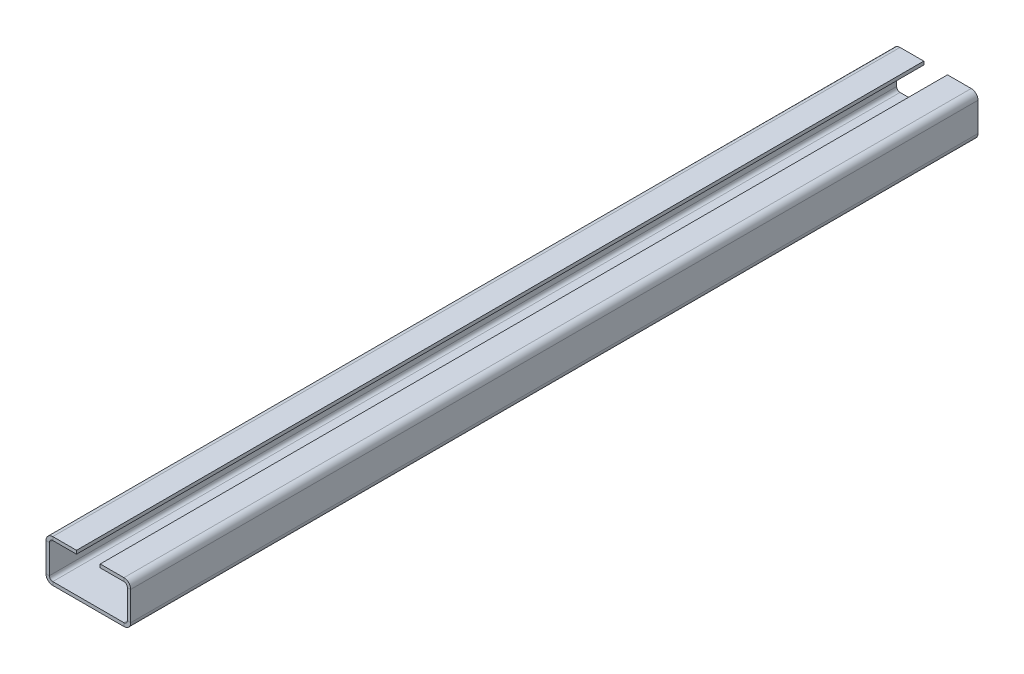
ISO-10303-21;
HEADER;
FILE_DESCRIPTION(('STEP AP214'),'2;1');
FILE_NAME('part.step','',(''),(''),'','','');
FILE_SCHEMA(('AUTOMOTIVE_DESIGN { 1 0 10303 214 1 1 1 1 }'));
ENDSEC;
DATA;
#1=APPLICATION_CONTEXT('core data for automotive mechanical design processes');
#2=APPLICATION_PROTOCOL_DEFINITION('international standard','automotive_design',2000,#1);
#3=PRODUCT_CONTEXT('',#1,'mechanical');
#4=PRODUCT('Part','Part','',(#3));
#5=PRODUCT_RELATED_PRODUCT_CATEGORY('part','',(#4));
#6=PRODUCT_DEFINITION_FORMATION('','',#4);
#7=PRODUCT_DEFINITION_CONTEXT('part definition',#1,'design');
#8=PRODUCT_DEFINITION('design','',#6,#7);
#9=PRODUCT_DEFINITION_SHAPE('','',#8);
#10=(LENGTH_UNIT() NAMED_UNIT(*) SI_UNIT(.MILLI.,.METRE.));
#11=(NAMED_UNIT(*) PLANE_ANGLE_UNIT() SI_UNIT($,.RADIAN.));
#12=(NAMED_UNIT(*) SI_UNIT($,.STERADIAN.) SOLID_ANGLE_UNIT());
#13=UNCERTAINTY_MEASURE_WITH_UNIT(LENGTH_MEASURE(1.E-05),#10,'distance_accuracy_value','');
#14=(GEOMETRIC_REPRESENTATION_CONTEXT(3) GLOBAL_UNCERTAINTY_ASSIGNED_CONTEXT((#13)) GLOBAL_UNIT_ASSIGNED_CONTEXT((#10,
#11,#12)) REPRESENTATION_CONTEXT('',''));
#15=CARTESIAN_POINT('',(0.,0.,0.));
#16=DIRECTION('',(0.,0.,1.));
#17=DIRECTION('',(1.,0.,0.));
#18=AXIS2_PLACEMENT_3D('',#15,#16,#17);
#19=CARTESIAN_POINT('',(4.,25.,500.));
#20=DIRECTION('',(0.,0.,1.));
#21=DIRECTION('',(1.,0.,0.));
#22=AXIS2_PLACEMENT_3D('',#19,#20,#21);
#23=PLANE('',#22);
#24=DIRECTION('',(0.,-1.,0.));
#25=VECTOR('',#24,1.);
#26=CARTESIAN_POINT('',(4.,25.,500.));
#27=LINE('',#26,#25);
#28=CARTESIAN_POINT('',(4.,25.,500.));
#29=VERTEX_POINT('',#28);
#30=CARTESIAN_POINT('',(4.,23.,500.));
#31=VERTEX_POINT('',#30);
#32=EDGE_CURVE('E11',#29,#31,#27,.T.);
#33=ORIENTED_EDGE('',*,*,#32,.F.);
#34=CARTESIAN_POINT('',(4.,21.,500.));
#35=DIRECTION('',(0.,0.,-1.));
#36=DIRECTION('',(-1.,0.,0.));
#37=AXIS2_PLACEMENT_3D('',#34,#35,#36);
#38=CIRCLE('',#37,4.);
#39=CARTESIAN_POINT('',(0.,21.,500.));
#40=VERTEX_POINT('',#39);
#41=EDGE_CURVE('E361',#29,#40,#38,.F.);
#42=ORIENTED_EDGE('',*,*,#41,.T.);
#43=DIRECTION('',(-1.,0.,0.));
#44=VECTOR('',#43,1.);
#45=CARTESIAN_POINT('',(2.,21.,500.));
#46=LINE('',#45,#44);
#47=CARTESIAN_POINT('',(2.,21.,500.));
#48=VERTEX_POINT('',#47);
#49=EDGE_CURVE('E44',#48,#40,#46,.T.);
#50=ORIENTED_EDGE('',*,*,#49,.F.);
#51=CARTESIAN_POINT('',(4.,21.,500.));
#52=DIRECTION('',(0.,0.,1.));
#53=DIRECTION('',(1.,0.,0.));
#54=AXIS2_PLACEMENT_3D('',#51,#52,#53);
#55=CIRCLE('',#54,2.);
#56=EDGE_CURVE('E436',#31,#48,#55,.T.);
#57=ORIENTED_EDGE('',*,*,#56,.F.);
#58=EDGE_LOOP('',(#33,#42,#50,#57));
#59=FACE_BOUND('',#58,.T.);
#60=ADVANCED_FACE('F36',(#59),#23,.T.);
#61=CARTESIAN_POINT('',(2.,21.,500.));
#62=DIRECTION('',(0.,0.,1.));
#63=DIRECTION('',(1.,0.,0.));
#64=AXIS2_PLACEMENT_3D('',#61,#62,#63);
#65=PLANE('',#64);
#66=DIRECTION('',(-1.,0.,0.));
#67=VECTOR('',#66,1.);
#68=CARTESIAN_POINT('',(18.,25.,500.));
#69=LINE('',#68,#67);
#70=CARTESIAN_POINT('',(18.,25.,500.));
#71=VERTEX_POINT('',#70);
#72=EDGE_CURVE('E365',#71,#29,#69,.T.);
#73=ORIENTED_EDGE('',*,*,#72,.T.);
#74=ORIENTED_EDGE('',*,*,#32,.T.);
#75=DIRECTION('',(1.,0.,0.));
#76=VECTOR('',#75,1.);
#77=CARTESIAN_POINT('',(18.,23.,500.));
#78=LINE('',#77,#76);
#79=CARTESIAN_POINT('',(18.,23.,500.));
#80=VERTEX_POINT('',#79);
#81=EDGE_CURVE('E438',#80,#31,#78,.F.);
#82=ORIENTED_EDGE('',*,*,#81,.F.);
#83=DIRECTION('',(0.,-1.,0.));
#84=VECTOR('',#83,1.);
#85=CARTESIAN_POINT('',(18.,25.,500.));
#86=LINE('',#85,#84);
#87=EDGE_CURVE('E441',#71,#80,#86,.T.);
#88=ORIENTED_EDGE('',*,*,#87,.F.);
#89=EDGE_LOOP('',(#73,#74,#82,#88));
#90=FACE_BOUND('',#89,.T.);
#91=ADVANCED_FACE('F447',(#90),#65,.T.);
#92=CARTESIAN_POINT('',(0.,21.,0.));
#93=DIRECTION('',(0.,0.,-1.));
#94=DIRECTION('',(-1.,0.,0.));
#95=AXIS2_PLACEMENT_3D('',#92,#93,#94);
#96=PLANE('',#95);
#97=DIRECTION('',(1.,0.,0.));
#98=VECTOR('',#97,1.);
#99=CARTESIAN_POINT('',(0.,21.,0.));
#100=LINE('',#99,#98);
#101=CARTESIAN_POINT('',(0.,21.,0.));
#102=VERTEX_POINT('',#101);
#103=CARTESIAN_POINT('',(2.,21.,0.));
#104=VERTEX_POINT('',#103);
#105=EDGE_CURVE('E345',#102,#104,#100,.T.);
#106=ORIENTED_EDGE('',*,*,#105,.F.);
#107=CARTESIAN_POINT('',(4.,21.,0.));
#108=DIRECTION('',(0.,0.,-1.));
#109=DIRECTION('',(-1.,0.,0.));
#110=AXIS2_PLACEMENT_3D('',#107,#108,#109);
#111=CIRCLE('',#110,4.);
#112=CARTESIAN_POINT('',(4.,25.,0.));
#113=VERTEX_POINT('',#112);
#114=EDGE_CURVE('E261',#113,#102,#111,.F.);
#115=ORIENTED_EDGE('',*,*,#114,.F.);
#116=DIRECTION('',(0.,1.,0.));
#117=VECTOR('',#116,1.);
#118=CARTESIAN_POINT('',(4.,23.,0.));
#119=LINE('',#118,#117);
#120=CARTESIAN_POINT('',(4.,23.,0.));
#121=VERTEX_POINT('',#120);
#122=EDGE_CURVE('E343',#121,#113,#119,.T.);
#123=ORIENTED_EDGE('',*,*,#122,.F.);
#124=CARTESIAN_POINT('',(4.,21.,0.));
#125=DIRECTION('',(0.,0.,1.));
#126=DIRECTION('',(1.,0.,0.));
#127=AXIS2_PLACEMENT_3D('',#124,#125,#126);
#128=CIRCLE('',#127,2.);
#129=EDGE_CURVE('E249',#121,#104,#128,.T.);
#130=ORIENTED_EDGE('',*,*,#129,.T.);
#131=EDGE_LOOP('',(#106,#115,#123,#130));
#132=FACE_BOUND('',#131,.T.);
#133=ADVANCED_FACE('F454',(#132),#96,.T.);
#134=CARTESIAN_POINT('',(4.,23.,0.));
#135=DIRECTION('',(0.,0.,-1.));
#136=DIRECTION('',(-1.,0.,0.));
#137=AXIS2_PLACEMENT_3D('',#134,#135,#136);
#138=PLANE('',#137);
#139=DIRECTION('',(0.,-1.,0.));
#140=VECTOR('',#139,1.);
#141=CARTESIAN_POINT('',(0.,25.,0.));
#142=LINE('',#141,#140);
#143=CARTESIAN_POINT('',(0.,4.,0.));
#144=VERTEX_POINT('',#143);
#145=EDGE_CURVE('E264',#102,#144,#142,.T.);
#146=ORIENTED_EDGE('',*,*,#145,.F.);
#147=ORIENTED_EDGE('',*,*,#105,.T.);
#148=DIRECTION('',(0.,-1.,0.));
#149=VECTOR('',#148,1.);
#150=CARTESIAN_POINT('',(2.,25.,0.));
#151=LINE('',#150,#149);
#152=CARTESIAN_POINT('',(2.,4.,0.));
#153=VERTEX_POINT('',#152);
#154=EDGE_CURVE('E246',#104,#153,#151,.T.);
#155=ORIENTED_EDGE('',*,*,#154,.T.);
#156=DIRECTION('',(-1.,0.,0.));
#157=VECTOR('',#156,1.);
#158=CARTESIAN_POINT('',(2.,4.,0.));
#159=LINE('',#158,#157);
#160=EDGE_CURVE('E335',#153,#144,#159,.T.);
#161=ORIENTED_EDGE('',*,*,#160,.T.);
#162=EDGE_LOOP('',(#146,#147,#155,#161));
#163=FACE_BOUND('',#162,.T.);
#164=ADVANCED_FACE('F457',(#163),#138,.T.);
#165=CARTESIAN_POINT('',(0.,4.,500.));
#166=DIRECTION('',(0.,0.,1.));
#167=DIRECTION('',(1.,0.,0.));
#168=AXIS2_PLACEMENT_3D('',#165,#166,#167);
#169=PLANE('',#168);
#170=DIRECTION('',(1.,0.,0.));
#171=VECTOR('',#170,1.);
#172=CARTESIAN_POINT('',(0.,4.,500.));
#173=LINE('',#172,#171);
#174=CARTESIAN_POINT('',(0.,4.,500.));
#175=VERTEX_POINT('',#174);
#176=CARTESIAN_POINT('',(2.,4.,500.));
#177=VERTEX_POINT('',#176);
#178=EDGE_CURVE('E341',#175,#177,#173,.T.);
#179=ORIENTED_EDGE('',*,*,#178,.F.);
#180=CARTESIAN_POINT('',(4.,4.,500.));
#181=DIRECTION('',(0.,0.,-1.));
#182=DIRECTION('',(-1.,0.,0.));
#183=AXIS2_PLACEMENT_3D('',#180,#181,#182);
#184=CIRCLE('',#183,4.);
#185=CARTESIAN_POINT('',(4.,0.,500.));
#186=VERTEX_POINT('',#185);
#187=EDGE_CURVE('E373',#175,#186,#184,.F.);
#188=ORIENTED_EDGE('',*,*,#187,.T.);
#189=DIRECTION('',(0.,-1.,0.));
#190=VECTOR('',#189,1.);
#191=CARTESIAN_POINT('',(4.,2.,500.));
#192=LINE('',#191,#190);
#193=CARTESIAN_POINT('',(4.,2.,500.));
#194=VERTEX_POINT('',#193);
#195=EDGE_CURVE('E339',#194,#186,#192,.T.);
#196=ORIENTED_EDGE('',*,*,#195,.F.);
#197=CARTESIAN_POINT('',(4.,4.,500.));
#198=DIRECTION('',(0.,0.,1.));
#199=DIRECTION('',(1.,0.,0.));
#200=AXIS2_PLACEMENT_3D('',#197,#198,#199);
#201=CIRCLE('',#200,2.);
#202=EDGE_CURVE('E432',#177,#194,#201,.T.);
#203=ORIENTED_EDGE('',*,*,#202,.F.);
#204=EDGE_LOOP('',(#179,#188,#196,#203));
#205=FACE_BOUND('',#204,.T.);
#206=ADVANCED_FACE('F477',(#205),#169,.T.);
#207=CARTESIAN_POINT('',(4.,2.,500.));
#208=DIRECTION('',(0.,0.,1.));
#209=DIRECTION('',(1.,0.,0.));
#210=AXIS2_PLACEMENT_3D('',#207,#208,#209);
#211=PLANE('',#210);
#212=DIRECTION('',(0.,-1.,0.));
#213=VECTOR('',#212,1.);
#214=CARTESIAN_POINT('',(0.,25.,500.));
#215=LINE('',#214,#213);
#216=EDGE_CURVE('E352',#40,#175,#215,.T.);
#217=ORIENTED_EDGE('',*,*,#216,.T.);
#218=ORIENTED_EDGE('',*,*,#178,.T.);
#219=DIRECTION('',(0.,-1.,0.));
#220=VECTOR('',#219,1.);
#221=CARTESIAN_POINT('',(2.,25.,500.));
#222=LINE('',#221,#220);
#223=EDGE_CURVE('E355',#48,#177,#222,.T.);
#224=ORIENTED_EDGE('',*,*,#223,.F.);
#225=ORIENTED_EDGE('',*,*,#49,.T.);
#226=EDGE_LOOP('',(#217,#218,#224,#225));
#227=FACE_BOUND('',#226,.T.);
#228=ADVANCED_FACE('F350',(#227),#211,.T.);
#229=CARTESIAN_POINT('',(4.,0.,0.));
#230=DIRECTION('',(0.,0.,-1.));
#231=DIRECTION('',(-1.,0.,0.));
#232=AXIS2_PLACEMENT_3D('',#229,#230,#231);
#233=PLANE('',#232);
#234=DIRECTION('',(0.,1.,0.));
#235=VECTOR('',#234,1.);
#236=CARTESIAN_POINT('',(4.,0.,0.));
#237=LINE('',#236,#235);
#238=CARTESIAN_POINT('',(4.,0.,0.));
#239=VERTEX_POINT('',#238);
#240=CARTESIAN_POINT('',(4.,2.,0.));
#241=VERTEX_POINT('',#240);
#242=EDGE_CURVE('E337',#239,#241,#237,.T.);
#243=ORIENTED_EDGE('',*,*,#242,.F.);
#244=CARTESIAN_POINT('',(4.,4.,0.));
#245=DIRECTION('',(0.,0.,-1.));
#246=DIRECTION('',(-1.,0.,0.));
#247=AXIS2_PLACEMENT_3D('',#244,#245,#246);
#248=CIRCLE('',#247,4.);
#249=EDGE_CURVE('E267',#144,#239,#248,.F.);
#250=ORIENTED_EDGE('',*,*,#249,.F.);
#251=ORIENTED_EDGE('',*,*,#160,.F.);
#252=CARTESIAN_POINT('',(4.,4.,0.));
#253=DIRECTION('',(0.,0.,1.));
#254=DIRECTION('',(1.,0.,0.));
#255=AXIS2_PLACEMENT_3D('',#252,#253,#254);
#256=CIRCLE('',#255,2.);
#257=EDGE_CURVE('E243',#153,#241,#256,.T.);
#258=ORIENTED_EDGE('',*,*,#257,.T.);
#259=EDGE_LOOP('',(#243,#250,#251,#258));
#260=FACE_BOUND('',#259,.T.);
#261=ADVANCED_FACE('F471',(#260),#233,.T.);
#262=CARTESIAN_POINT('',(2.,4.,0.));
#263=DIRECTION('',(0.,0.,-1.));
#264=DIRECTION('',(-1.,0.,0.));
#265=AXIS2_PLACEMENT_3D('',#262,#263,#264);
#266=PLANE('',#265);
#267=DIRECTION('',(1.,0.,0.));
#268=VECTOR('',#267,1.);
#269=CARTESIAN_POINT('',(0.,0.,0.));
#270=LINE('',#269,#268);
#271=CARTESIAN_POINT('',(46.,0.,0.));
#272=VERTEX_POINT('',#271);
#273=EDGE_CURVE('E270',#239,#272,#270,.T.);
#274=ORIENTED_EDGE('',*,*,#273,.F.);
#275=ORIENTED_EDGE('',*,*,#242,.T.);
#276=DIRECTION('',(1.,0.,0.));
#277=VECTOR('',#276,1.);
#278=CARTESIAN_POINT('',(0.,2.,0.));
#279=LINE('',#278,#277);
#280=CARTESIAN_POINT('',(46.,2.,0.));
#281=VERTEX_POINT('',#280);
#282=EDGE_CURVE('E240',#241,#281,#279,.T.);
#283=ORIENTED_EDGE('',*,*,#282,.T.);
#284=DIRECTION('',(0.,-1.,0.));
#285=VECTOR('',#284,1.);
#286=CARTESIAN_POINT('',(46.,2.,0.));
#287=LINE('',#286,#285);
#288=EDGE_CURVE('E331',#281,#272,#287,.T.);
#289=ORIENTED_EDGE('',*,*,#288,.T.);
#290=EDGE_LOOP('',(#274,#275,#283,#289));
#291=FACE_BOUND('',#290,.T.);
#292=ADVANCED_FACE('F481',(#291),#266,.T.);
#293=CARTESIAN_POINT('',(46.,0.,500.));
#294=DIRECTION('',(0.,0.,1.));
#295=DIRECTION('',(1.,0.,0.));
#296=AXIS2_PLACEMENT_3D('',#293,#294,#295);
#297=PLANE('',#296);
#298=DIRECTION('',(0.,1.,0.));
#299=VECTOR('',#298,1.);
#300=CARTESIAN_POINT('',(46.,0.,500.));
#301=LINE('',#300,#299);
#302=CARTESIAN_POINT('',(46.,0.,500.));
#303=VERTEX_POINT('',#302);
#304=CARTESIAN_POINT('',(46.,2.,500.));
#305=VERTEX_POINT('',#304);
#306=EDGE_CURVE('E193',#303,#305,#301,.T.);
#307=ORIENTED_EDGE('',*,*,#306,.F.);
#308=CARTESIAN_POINT('',(46.,4.,500.));
#309=DIRECTION('',(0.,0.,-1.));
#310=DIRECTION('',(-1.,0.,0.));
#311=AXIS2_PLACEMENT_3D('',#308,#309,#310);
#312=CIRCLE('',#311,4.);
#313=CARTESIAN_POINT('',(50.,4.,500.));
#314=VERTEX_POINT('',#313);
#315=EDGE_CURVE('E197',#303,#314,#312,.F.);
#316=ORIENTED_EDGE('',*,*,#315,.T.);
#317=DIRECTION('',(1.,0.,0.));
#318=VECTOR('',#317,1.);
#319=CARTESIAN_POINT('',(48.,4.,500.));
#320=LINE('',#319,#318);
#321=CARTESIAN_POINT('',(48.,4.,500.));
#322=VERTEX_POINT('',#321);
#323=EDGE_CURVE('E181',#322,#314,#320,.T.);
#324=ORIENTED_EDGE('',*,*,#323,.F.);
#325=CARTESIAN_POINT('',(46.,4.,500.));
#326=DIRECTION('',(0.,0.,1.));
#327=DIRECTION('',(1.,0.,0.));
#328=AXIS2_PLACEMENT_3D('',#325,#326,#327);
#329=CIRCLE('',#328,2.);
#330=EDGE_CURVE('E394',#305,#322,#329,.T.);
#331=ORIENTED_EDGE('',*,*,#330,.F.);
#332=EDGE_LOOP('',(#307,#316,#324,#331));
#333=FACE_BOUND('',#332,.T.);
#334=ADVANCED_FACE('F199',(#333),#297,.T.);
#335=CARTESIAN_POINT('',(48.,4.,500.));
#336=DIRECTION('',(0.,0.,1.));
#337=DIRECTION('',(1.,0.,0.));
#338=AXIS2_PLACEMENT_3D('',#335,#336,#337);
#339=PLANE('',#338);
#340=DIRECTION('',(1.,0.,0.));
#341=VECTOR('',#340,1.);
#342=CARTESIAN_POINT('',(0.,0.,500.));
#343=LINE('',#342,#341);
#344=EDGE_CURVE('E203',#186,#303,#343,.T.);
#345=ORIENTED_EDGE('',*,*,#344,.T.);
#346=ORIENTED_EDGE('',*,*,#306,.T.);
#347=DIRECTION('',(1.,0.,0.));
#348=VECTOR('',#347,1.);
#349=CARTESIAN_POINT('',(0.,2.,500.));
#350=LINE('',#349,#348);
#351=EDGE_CURVE('E429',#194,#305,#350,.T.);
#352=ORIENTED_EDGE('',*,*,#351,.F.);
#353=ORIENTED_EDGE('',*,*,#195,.T.);
#354=EDGE_LOOP('',(#345,#346,#352,#353));
#355=FACE_BOUND('',#354,.T.);
#356=ADVANCED_FACE('F381',(#355),#339,.T.);
#357=CARTESIAN_POINT('',(50.,4.,0.));
#358=DIRECTION('',(0.,0.,-1.));
#359=DIRECTION('',(-1.,0.,0.));
#360=AXIS2_PLACEMENT_3D('',#357,#358,#359);
#361=PLANE('',#360);
#362=DIRECTION('',(-1.,0.,0.));
#363=VECTOR('',#362,1.);
#364=CARTESIAN_POINT('',(50.,4.,0.));
#365=LINE('',#364,#363);
#366=CARTESIAN_POINT('',(50.,4.,0.));
#367=VERTEX_POINT('',#366);
#368=CARTESIAN_POINT('',(48.,4.,0.));
#369=VERTEX_POINT('',#368);
#370=EDGE_CURVE('E194',#367,#369,#365,.T.);
#371=ORIENTED_EDGE('',*,*,#370,.F.);
#372=CARTESIAN_POINT('',(46.,4.,0.));
#373=DIRECTION('',(0.,0.,-1.));
#374=DIRECTION('',(-1.,0.,0.));
#375=AXIS2_PLACEMENT_3D('',#372,#373,#374);
#376=CIRCLE('',#375,4.);
#377=EDGE_CURVE('E210',#272,#367,#376,.F.);
#378=ORIENTED_EDGE('',*,*,#377,.F.);
#379=ORIENTED_EDGE('',*,*,#288,.F.);
#380=CARTESIAN_POINT('',(46.,4.,0.));
#381=DIRECTION('',(0.,0.,1.));
#382=DIRECTION('',(1.,0.,0.));
#383=AXIS2_PLACEMENT_3D('',#380,#381,#382);
#384=CIRCLE('',#383,2.);
#385=EDGE_CURVE('E237',#281,#369,#384,.T.);
#386=ORIENTED_EDGE('',*,*,#385,.T.);
#387=EDGE_LOOP('',(#371,#378,#379,#386));
#388=FACE_BOUND('',#387,.T.);
#389=ADVANCED_FACE('F388',(#388),#361,.T.);
#390=CARTESIAN_POINT('',(46.,2.,0.));
#391=DIRECTION('',(0.,0.,-1.));
#392=DIRECTION('',(-1.,0.,0.));
#393=AXIS2_PLACEMENT_3D('',#390,#391,#392);
#394=PLANE('',#393);
#395=DIRECTION('',(0.,1.,0.));
#396=VECTOR('',#395,1.);
#397=CARTESIAN_POINT('',(50.,0.,0.));
#398=LINE('',#397,#396);
#399=CARTESIAN_POINT('',(50.,21.,0.));
#400=VERTEX_POINT('',#399);
#401=EDGE_CURVE('E274',#367,#400,#398,.T.);
#402=ORIENTED_EDGE('',*,*,#401,.F.);
#403=ORIENTED_EDGE('',*,*,#370,.T.);
#404=DIRECTION('',(0.,1.,0.));
#405=VECTOR('',#404,1.);
#406=CARTESIAN_POINT('',(48.,0.,0.));
#407=LINE('',#406,#405);
#408=CARTESIAN_POINT('',(48.,21.,0.));
#409=VERTEX_POINT('',#408);
#410=EDGE_CURVE('E235',#369,#409,#407,.T.);
#411=ORIENTED_EDGE('',*,*,#410,.T.);
#412=DIRECTION('',(1.,0.,0.));
#413=VECTOR('',#412,1.);
#414=CARTESIAN_POINT('',(48.,21.,0.));
#415=LINE('',#414,#413);
#416=EDGE_CURVE('E117',#409,#400,#415,.T.);
#417=ORIENTED_EDGE('',*,*,#416,.T.);
#418=EDGE_LOOP('',(#402,#403,#411,#417));
#419=FACE_BOUND('',#418,.T.);
#420=ADVANCED_FACE('F390',(#419),#394,.T.);
#421=CARTESIAN_POINT('',(50.,21.,500.));
#422=DIRECTION('',(0.,0.,1.));
#423=DIRECTION('',(1.,0.,0.));
#424=AXIS2_PLACEMENT_3D('',#421,#422,#423);
#425=PLANE('',#424);
#426=DIRECTION('',(-1.,0.,0.));
#427=VECTOR('',#426,1.);
#428=CARTESIAN_POINT('',(50.,21.,500.));
#429=LINE('',#428,#427);
#430=CARTESIAN_POINT('',(50.,21.,500.));
#431=VERTEX_POINT('',#430);
#432=CARTESIAN_POINT('',(48.,21.,500.));
#433=VERTEX_POINT('',#432);
#434=EDGE_CURVE('E329',#431,#433,#429,.T.);
#435=ORIENTED_EDGE('',*,*,#434,.F.);
#436=CARTESIAN_POINT('',(46.,21.,500.));
#437=DIRECTION('',(0.,0.,-1.));
#438=DIRECTION('',(-1.,0.,0.));
#439=AXIS2_PLACEMENT_3D('',#436,#437,#438);
#440=CIRCLE('',#439,4.);
#441=CARTESIAN_POINT('',(46.,25.,500.));
#442=VERTEX_POINT('',#441);
#443=EDGE_CURVE('E218',#431,#442,#440,.F.);
#444=ORIENTED_EDGE('',*,*,#443,.T.);
#445=DIRECTION('',(0.,1.,0.));
#446=VECTOR('',#445,1.);
#447=CARTESIAN_POINT('',(46.,23.,500.));
#448=LINE('',#447,#446);
#449=CARTESIAN_POINT('',(46.,23.,500.));
#450=VERTEX_POINT('',#449);
#451=EDGE_CURVE('E52',#450,#442,#448,.T.);
#452=ORIENTED_EDGE('',*,*,#451,.F.);
#453=CARTESIAN_POINT('',(46.,21.,500.));
#454=DIRECTION('',(0.,0.,1.));
#455=DIRECTION('',(1.,0.,0.));
#456=AXIS2_PLACEMENT_3D('',#453,#454,#455);
#457=CIRCLE('',#456,2.);
#458=EDGE_CURVE('E422',#433,#450,#457,.T.);
#459=ORIENTED_EDGE('',*,*,#458,.F.);
#460=EDGE_LOOP('',(#435,#444,#452,#459));
#461=FACE_BOUND('',#460,.T.);
#462=ADVANCED_FACE('F552',(#461),#425,.T.);
#463=CARTESIAN_POINT('',(46.,23.,500.));
#464=DIRECTION('',(0.,0.,1.));
#465=DIRECTION('',(1.,0.,0.));
#466=AXIS2_PLACEMENT_3D('',#463,#464,#465);
#467=PLANE('',#466);
#468=DIRECTION('',(0.,1.,0.));
#469=VECTOR('',#468,1.);
#470=CARTESIAN_POINT('',(50.,0.,500.));
#471=LINE('',#470,#469);
#472=EDGE_CURVE('E185',#314,#431,#471,.T.);
#473=ORIENTED_EDGE('',*,*,#472,.T.);
#474=ORIENTED_EDGE('',*,*,#434,.T.);
#475=DIRECTION('',(0.,1.,0.));
#476=VECTOR('',#475,1.);
#477=CARTESIAN_POINT('',(48.,0.,500.));
#478=LINE('',#477,#476);
#479=EDGE_CURVE('E188',#322,#433,#478,.T.);
#480=ORIENTED_EDGE('',*,*,#479,.F.);
#481=ORIENTED_EDGE('',*,*,#323,.T.);
#482=EDGE_LOOP('',(#473,#474,#480,#481));
#483=FACE_BOUND('',#482,.T.);
#484=ADVANCED_FACE('F183',(#483),#467,.T.);
#485=CARTESIAN_POINT('',(46.,25.,0.));
#486=DIRECTION('',(0.,0.,-1.));
#487=DIRECTION('',(-1.,0.,0.));
#488=AXIS2_PLACEMENT_3D('',#485,#486,#487);
#489=PLANE('',#488);
#490=DIRECTION('',(0.,-1.,0.));
#491=VECTOR('',#490,1.);
#492=CARTESIAN_POINT('',(46.,25.,0.));
#493=LINE('',#492,#491);
#494=CARTESIAN_POINT('',(46.,25.,0.));
#495=VERTEX_POINT('',#494);
#496=CARTESIAN_POINT('',(46.,23.,0.));
#497=VERTEX_POINT('',#496);
#498=EDGE_CURVE('E124',#495,#497,#493,.T.);
#499=ORIENTED_EDGE('',*,*,#498,.F.);
#500=CARTESIAN_POINT('',(46.,21.,0.));
#501=DIRECTION('',(0.,0.,-1.));
#502=DIRECTION('',(-1.,0.,0.));
#503=AXIS2_PLACEMENT_3D('',#500,#501,#502);
#504=CIRCLE('',#503,4.);
#505=EDGE_CURVE('E276',#400,#495,#504,.F.);
#506=ORIENTED_EDGE('',*,*,#505,.F.);
#507=ORIENTED_EDGE('',*,*,#416,.F.);
#508=CARTESIAN_POINT('',(46.,21.,0.));
#509=DIRECTION('',(0.,0.,1.));
#510=DIRECTION('',(1.,0.,0.));
#511=AXIS2_PLACEMENT_3D('',#508,#509,#510);
#512=CIRCLE('',#511,2.);
#513=EDGE_CURVE('E233',#409,#497,#512,.T.);
#514=ORIENTED_EDGE('',*,*,#513,.T.);
#515=EDGE_LOOP('',(#499,#506,#507,#514));
#516=FACE_BOUND('',#515,.T.);
#517=ADVANCED_FACE('F405',(#516),#489,.T.);
#518=CARTESIAN_POINT('',(48.,21.,0.));
#519=DIRECTION('',(0.,0.,-1.));
#520=DIRECTION('',(-1.,0.,0.));
#521=AXIS2_PLACEMENT_3D('',#518,#519,#520);
#522=PLANE('',#521);
#523=DIRECTION('',(-1.,0.,0.));
#524=VECTOR('',#523,1.);
#525=CARTESIAN_POINT('',(50.,25.,0.));
#526=LINE('',#525,#524);
#527=CARTESIAN_POINT('',(32.,25.,0.));
#528=VERTEX_POINT('',#527);
#529=EDGE_CURVE('E224',#495,#528,#526,.T.);
#530=ORIENTED_EDGE('',*,*,#529,.F.);
#531=ORIENTED_EDGE('',*,*,#498,.T.);
#532=DIRECTION('',(-1.,0.,0.));
#533=VECTOR('',#532,1.);
#534=CARTESIAN_POINT('',(50.,23.,0.));
#535=LINE('',#534,#533);
#536=CARTESIAN_POINT('',(32.,23.,0.));
#537=VERTEX_POINT('',#536);
#538=EDGE_CURVE('E230',#497,#537,#535,.T.);
#539=ORIENTED_EDGE('',*,*,#538,.T.);
#540=DIRECTION('',(0.,1.,0.));
#541=VECTOR('',#540,1.);
#542=CARTESIAN_POINT('',(32.,23.,0.));
#543=LINE('',#542,#541);
#544=EDGE_CURVE('E227',#537,#528,#543,.T.);
#545=ORIENTED_EDGE('',*,*,#544,.T.);
#546=EDGE_LOOP('',(#530,#531,#539,#545));
#547=FACE_BOUND('',#546,.T.);
#548=ADVANCED_FACE('F413',(#547),#522,.T.);
#549=CARTESIAN_POINT('',(50.,25.,500.));
#550=DIRECTION('',(0.,-1.,0.));
#551=DIRECTION('',(1.,0.,0.));
#552=AXIS2_PLACEMENT_3D('',#549,#550,#551);
#553=PLANE('',#552);
#554=ORIENTED_EDGE('',*,*,#529,.T.);
#555=DIRECTION('',(0.,0.,-1.));
#556=VECTOR('',#555,1.);
#557=CARTESIAN_POINT('',(32.,25.,500.));
#558=LINE('',#557,#556);
#559=CARTESIAN_POINT('',(32.,25.,500.));
#560=VERTEX_POINT('',#559);
#561=EDGE_CURVE('E324',#560,#528,#558,.T.);
#562=ORIENTED_EDGE('',*,*,#561,.F.);
#563=DIRECTION('',(-1.,0.,0.));
#564=VECTOR('',#563,1.);
#565=CARTESIAN_POINT('',(50.,25.,500.));
#566=LINE('',#565,#564);
#567=EDGE_CURVE('E130',#442,#560,#566,.T.);
#568=ORIENTED_EDGE('',*,*,#567,.F.);
#569=DIRECTION('',(0.,0.,-1.));
#570=VECTOR('',#569,1.);
#571=CARTESIAN_POINT('',(46.,25.,500.));
#572=LINE('',#571,#570);
#573=EDGE_CURVE('E220',#442,#495,#572,.T.);
#574=ORIENTED_EDGE('',*,*,#573,.T.);
#575=EDGE_LOOP('',(#554,#562,#568,#574));
#576=FACE_BOUND('',#575,.T.);
#577=ADVANCED_FACE('F411',(#576),#553,.F.);
#578=CARTESIAN_POINT('',(32.,23.,500.));
#579=DIRECTION('',(-1.,0.,0.));
#580=DIRECTION('',(0.,0.,1.));
#581=AXIS2_PLACEMENT_3D('',#578,#579,#580);
#582=PLANE('',#581);
#583=ORIENTED_EDGE('',*,*,#544,.F.);
#584=DIRECTION('',(0.,0.,-1.));
#585=VECTOR('',#584,1.);
#586=CARTESIAN_POINT('',(32.,23.,500.));
#587=LINE('',#586,#585);
#588=CARTESIAN_POINT('',(32.,23.,500.));
#589=VERTEX_POINT('',#588);
#590=EDGE_CURVE('E322',#589,#537,#587,.T.);
#591=ORIENTED_EDGE('',*,*,#590,.F.);
#592=DIRECTION('',(0.,1.,0.));
#593=VECTOR('',#592,1.);
#594=CARTESIAN_POINT('',(32.,23.,500.));
#595=LINE('',#594,#593);
#596=EDGE_CURVE('E418',#589,#560,#595,.T.);
#597=ORIENTED_EDGE('',*,*,#596,.T.);
#598=ORIENTED_EDGE('',*,*,#561,.T.);
#599=EDGE_LOOP('',(#583,#591,#597,#598));
#600=FACE_BOUND('',#599,.T.);
#601=ADVANCED_FACE('F416',(#600),#582,.T.);
#602=CARTESIAN_POINT('',(50.,23.,500.));
#603=DIRECTION('',(0.,-1.,0.));
#604=DIRECTION('',(1.,0.,0.));
#605=AXIS2_PLACEMENT_3D('',#602,#603,#604);
#606=PLANE('',#605);
#607=ORIENTED_EDGE('',*,*,#538,.F.);
#608=DIRECTION('',(0.,0.,-1.));
#609=VECTOR('',#608,1.);
#610=CARTESIAN_POINT('',(46.,23.,500.));
#611=LINE('',#610,#609);
#612=EDGE_CURVE('E319',#450,#497,#611,.T.);
#613=ORIENTED_EDGE('',*,*,#612,.F.);
#614=DIRECTION('',(-1.,0.,0.));
#615=VECTOR('',#614,1.);
#616=CARTESIAN_POINT('',(50.,23.,500.));
#617=LINE('',#616,#615);
#618=EDGE_CURVE('E420',#450,#589,#617,.T.);
#619=ORIENTED_EDGE('',*,*,#618,.T.);
#620=ORIENTED_EDGE('',*,*,#590,.T.);
#621=EDGE_LOOP('',(#607,#613,#619,#620));
#622=FACE_BOUND('',#621,.T.);
#623=ADVANCED_FACE('F608',(#622),#606,.T.);
#624=CARTESIAN_POINT('',(46.,21.,500.));
#625=DIRECTION('',(0.,0.,-1.));
#626=DIRECTION('',(-1.,0.,0.));
#627=AXIS2_PLACEMENT_3D('',#624,#625,#626);
#628=CYLINDRICAL_SURFACE('',#627,2.);
#629=ORIENTED_EDGE('',*,*,#513,.F.);
#630=DIRECTION('',(0.,0.,-1.));
#631=VECTOR('',#630,1.);
#632=CARTESIAN_POINT('',(48.,21.,500.));
#633=LINE('',#632,#631);
#634=EDGE_CURVE('E316',#433,#409,#633,.T.);
#635=ORIENTED_EDGE('',*,*,#634,.F.);
#636=ORIENTED_EDGE('',*,*,#458,.T.);
#637=ORIENTED_EDGE('',*,*,#612,.T.);
#638=EDGE_LOOP('',(#629,#635,#636,#637));
#639=FACE_BOUND('',#638,.T.);
#640=ADVANCED_FACE('F402',(#639),#628,.F.);
#641=CARTESIAN_POINT('',(48.,0.,500.));
#642=DIRECTION('',(-1.,0.,0.));
#643=DIRECTION('',(0.,0.,1.));
#644=AXIS2_PLACEMENT_3D('',#641,#642,#643);
#645=PLANE('',#644);
#646=ORIENTED_EDGE('',*,*,#410,.F.);
#647=DIRECTION('',(0.,0.,-1.));
#648=VECTOR('',#647,1.);
#649=CARTESIAN_POINT('',(48.,4.,500.));
#650=LINE('',#649,#648);
#651=EDGE_CURVE('E313',#322,#369,#650,.T.);
#652=ORIENTED_EDGE('',*,*,#651,.F.);
#653=ORIENTED_EDGE('',*,*,#479,.T.);
#654=ORIENTED_EDGE('',*,*,#634,.T.);
#655=EDGE_LOOP('',(#646,#652,#653,#654));
#656=FACE_BOUND('',#655,.T.);
#657=ADVANCED_FACE('F396',(#656),#645,.T.);
#658=CARTESIAN_POINT('',(46.,4.,500.));
#659=DIRECTION('',(0.,0.,-1.));
#660=DIRECTION('',(-1.,0.,0.));
#661=AXIS2_PLACEMENT_3D('',#658,#659,#660);
#662=CYLINDRICAL_SURFACE('',#661,2.);
#663=ORIENTED_EDGE('',*,*,#385,.F.);
#664=DIRECTION('',(0.,0.,-1.));
#665=VECTOR('',#664,1.);
#666=CARTESIAN_POINT('',(46.,2.,500.));
#667=LINE('',#666,#665);
#668=EDGE_CURVE('E310',#305,#281,#667,.T.);
#669=ORIENTED_EDGE('',*,*,#668,.F.);
#670=ORIENTED_EDGE('',*,*,#330,.T.);
#671=ORIENTED_EDGE('',*,*,#651,.T.);
#672=EDGE_LOOP('',(#663,#669,#670,#671));
#673=FACE_BOUND('',#672,.T.);
#674=ADVANCED_FACE('F393',(#673),#662,.F.);
#675=CARTESIAN_POINT('',(0.,2.,500.));
#676=DIRECTION('',(0.,1.,0.));
#677=DIRECTION('',(0.,0.,1.));
#678=AXIS2_PLACEMENT_3D('',#675,#676,#677);
#679=PLANE('',#678);
#680=ORIENTED_EDGE('',*,*,#282,.F.);
#681=DIRECTION('',(0.,0.,-1.));
#682=VECTOR('',#681,1.);
#683=CARTESIAN_POINT('',(4.,2.,500.));
#684=LINE('',#683,#682);
#685=EDGE_CURVE('E307',#194,#241,#684,.T.);
#686=ORIENTED_EDGE('',*,*,#685,.F.);
#687=ORIENTED_EDGE('',*,*,#351,.T.);
#688=ORIENTED_EDGE('',*,*,#668,.T.);
#689=EDGE_LOOP('',(#680,#686,#687,#688));
#690=FACE_BOUND('',#689,.T.);
#691=ADVANCED_FACE('F479',(#690),#679,.T.);
#692=CARTESIAN_POINT('',(4.,4.,500.));
#693=DIRECTION('',(0.,0.,-1.));
#694=DIRECTION('',(-1.,0.,0.));
#695=AXIS2_PLACEMENT_3D('',#692,#693,#694);
#696=CYLINDRICAL_SURFACE('',#695,2.);
#697=ORIENTED_EDGE('',*,*,#257,.F.);
#698=DIRECTION('',(0.,0.,-1.));
#699=VECTOR('',#698,1.);
#700=CARTESIAN_POINT('',(2.,4.,500.));
#701=LINE('',#700,#699);
#702=EDGE_CURVE('E304',#177,#153,#701,.T.);
#703=ORIENTED_EDGE('',*,*,#702,.F.);
#704=ORIENTED_EDGE('',*,*,#202,.T.);
#705=ORIENTED_EDGE('',*,*,#685,.T.);
#706=EDGE_LOOP('',(#697,#703,#704,#705));
#707=FACE_BOUND('',#706,.T.);
#708=ADVANCED_FACE('F467',(#707),#696,.F.);
#709=CARTESIAN_POINT('',(2.,25.,500.));
#710=DIRECTION('',(1.,0.,0.));
#711=DIRECTION('',(0.,1.,0.));
#712=AXIS2_PLACEMENT_3D('',#709,#710,#711);
#713=PLANE('',#712);
#714=ORIENTED_EDGE('',*,*,#154,.F.);
#715=DIRECTION('',(0.,0.,-1.));
#716=VECTOR('',#715,1.);
#717=CARTESIAN_POINT('',(2.,21.,500.));
#718=LINE('',#717,#716);
#719=EDGE_CURVE('E301',#48,#104,#718,.T.);
#720=ORIENTED_EDGE('',*,*,#719,.F.);
#721=ORIENTED_EDGE('',*,*,#223,.T.);
#722=ORIENTED_EDGE('',*,*,#702,.T.);
#723=EDGE_LOOP('',(#714,#720,#721,#722));
#724=FACE_BOUND('',#723,.T.);
#725=ADVANCED_FACE('F462',(#724),#713,.T.);
#726=CARTESIAN_POINT('',(4.,21.,500.));
#727=DIRECTION('',(0.,0.,-1.));
#728=DIRECTION('',(-1.,0.,0.));
#729=AXIS2_PLACEMENT_3D('',#726,#727,#728);
#730=CYLINDRICAL_SURFACE('',#729,2.);
#731=ORIENTED_EDGE('',*,*,#129,.F.);
#732=DIRECTION('',(0.,0.,-1.));
#733=VECTOR('',#732,1.);
#734=CARTESIAN_POINT('',(4.,23.,500.));
#735=LINE('',#734,#733);
#736=EDGE_CURVE('E298',#31,#121,#735,.T.);
#737=ORIENTED_EDGE('',*,*,#736,.F.);
#738=ORIENTED_EDGE('',*,*,#56,.T.);
#739=ORIENTED_EDGE('',*,*,#719,.T.);
#740=EDGE_LOOP('',(#731,#737,#738,#739));
#741=FACE_BOUND('',#740,.T.);
#742=ADVANCED_FACE('F460',(#741),#730,.F.);
#743=CARTESIAN_POINT('',(18.,23.,500.));
#744=DIRECTION('',(0.,-1.,0.));
#745=DIRECTION('',(0.,0.,-1.));
#746=AXIS2_PLACEMENT_3D('',#743,#744,#745);
#747=PLANE('',#746);
#748=DIRECTION('',(1.,0.,0.));
#749=VECTOR('',#748,1.);
#750=CARTESIAN_POINT('',(18.,23.,0.));
#751=LINE('',#750,#749);
#752=CARTESIAN_POINT('',(18.,23.,0.));
#753=VERTEX_POINT('',#752);
#754=EDGE_CURVE('E252',#753,#121,#751,.F.);
#755=ORIENTED_EDGE('',*,*,#754,.F.);
#756=DIRECTION('',(0.,0.,-1.));
#757=VECTOR('',#756,1.);
#758=CARTESIAN_POINT('',(18.,23.,500.));
#759=LINE('',#758,#757);
#760=EDGE_CURVE('E296',#80,#753,#759,.T.);
#761=ORIENTED_EDGE('',*,*,#760,.F.);
#762=ORIENTED_EDGE('',*,*,#81,.T.);
#763=ORIENTED_EDGE('',*,*,#736,.T.);
#764=EDGE_LOOP('',(#755,#761,#762,#763));
#765=FACE_BOUND('',#764,.T.);
#766=ADVANCED_FACE('F682',(#765),#747,.T.);
#767=CARTESIAN_POINT('',(18.,25.,500.));
#768=DIRECTION('',(1.,0.,0.));
#769=DIRECTION('',(0.,0.,-1.));
#770=AXIS2_PLACEMENT_3D('',#767,#768,#769);
#771=PLANE('',#770);
#772=DIRECTION('',(0.,-1.,0.));
#773=VECTOR('',#772,1.);
#774=CARTESIAN_POINT('',(18.,25.,0.));
#775=LINE('',#774,#773);
#776=CARTESIAN_POINT('',(18.,25.,0.));
#777=VERTEX_POINT('',#776);
#778=EDGE_CURVE('E255',#777,#753,#775,.T.);
#779=ORIENTED_EDGE('',*,*,#778,.F.);
#780=DIRECTION('',(0.,0.,-1.));
#781=VECTOR('',#780,1.);
#782=CARTESIAN_POINT('',(18.,25.,500.));
#783=LINE('',#782,#781);
#784=EDGE_CURVE('E294',#71,#777,#783,.T.);
#785=ORIENTED_EDGE('',*,*,#784,.F.);
#786=ORIENTED_EDGE('',*,*,#87,.T.);
#787=ORIENTED_EDGE('',*,*,#760,.T.);
#788=EDGE_LOOP('',(#779,#785,#786,#787));
#789=FACE_BOUND('',#788,.T.);
#790=ADVANCED_FACE('F692',(#789),#771,.T.);
#791=CARTESIAN_POINT('',(18.,25.,500.));
#792=DIRECTION('',(0.,-1.,0.));
#793=DIRECTION('',(0.,0.,-1.));
#794=AXIS2_PLACEMENT_3D('',#791,#792,#793);
#795=PLANE('',#794);
#796=DIRECTION('',(-1.,0.,0.));
#797=VECTOR('',#796,1.);
#798=CARTESIAN_POINT('',(18.,25.,0.));
#799=LINE('',#798,#797);
#800=EDGE_CURVE('E258',#777,#113,#799,.T.);
#801=ORIENTED_EDGE('',*,*,#800,.T.);
#802=DIRECTION('',(0.,0.,-1.));
#803=VECTOR('',#802,1.);
#804=CARTESIAN_POINT('',(4.,25.,500.));
#805=LINE('',#804,#803);
#806=EDGE_CURVE('E291',#29,#113,#805,.T.);
#807=ORIENTED_EDGE('',*,*,#806,.F.);
#808=ORIENTED_EDGE('',*,*,#72,.F.);
#809=ORIENTED_EDGE('',*,*,#784,.T.);
#810=EDGE_LOOP('',(#801,#807,#808,#809));
#811=FACE_BOUND('',#810,.T.);
#812=ADVANCED_FACE('F451',(#811),#795,.F.);
#813=CARTESIAN_POINT('',(4.,21.,500.));
#814=DIRECTION('',(0.,0.,-1.));
#815=DIRECTION('',(-1.,0.,0.));
#816=AXIS2_PLACEMENT_3D('',#813,#814,#815);
#817=CYLINDRICAL_SURFACE('',#816,4.);
#818=ORIENTED_EDGE('',*,*,#114,.T.);
#819=DIRECTION('',(0.,0.,-1.));
#820=VECTOR('',#819,1.);
#821=CARTESIAN_POINT('',(0.,21.,500.));
#822=LINE('',#821,#820);
#823=EDGE_CURVE('E288',#40,#102,#822,.T.);
#824=ORIENTED_EDGE('',*,*,#823,.F.);
#825=ORIENTED_EDGE('',*,*,#41,.F.);
#826=ORIENTED_EDGE('',*,*,#806,.T.);
#827=EDGE_LOOP('',(#818,#824,#825,#826));
#828=FACE_BOUND('',#827,.T.);
#829=ADVANCED_FACE('F367',(#828),#817,.T.);
#830=CARTESIAN_POINT('',(0.,25.,500.));
#831=DIRECTION('',(1.,0.,0.));
#832=DIRECTION('',(0.,1.,0.));
#833=AXIS2_PLACEMENT_3D('',#830,#831,#832);
#834=PLANE('',#833);
#835=ORIENTED_EDGE('',*,*,#145,.T.);
#836=DIRECTION('',(0.,0.,-1.));
#837=VECTOR('',#836,1.);
#838=CARTESIAN_POINT('',(0.,4.,500.));
#839=LINE('',#838,#837);
#840=EDGE_CURVE('E285',#175,#144,#839,.T.);
#841=ORIENTED_EDGE('',*,*,#840,.F.);
#842=ORIENTED_EDGE('',*,*,#216,.F.);
#843=ORIENTED_EDGE('',*,*,#823,.T.);
#844=EDGE_LOOP('',(#835,#841,#842,#843));
#845=FACE_BOUND('',#844,.T.);
#846=ADVANCED_FACE('F371',(#845),#834,.F.);
#847=CARTESIAN_POINT('',(4.,4.,500.));
#848=DIRECTION('',(0.,0.,-1.));
#849=DIRECTION('',(-1.,0.,0.));
#850=AXIS2_PLACEMENT_3D('',#847,#848,#849);
#851=CYLINDRICAL_SURFACE('',#850,4.);
#852=ORIENTED_EDGE('',*,*,#249,.T.);
#853=DIRECTION('',(0.,0.,-1.));
#854=VECTOR('',#853,1.);
#855=CARTESIAN_POINT('',(4.,0.,500.));
#856=LINE('',#855,#854);
#857=EDGE_CURVE('E282',#186,#239,#856,.T.);
#858=ORIENTED_EDGE('',*,*,#857,.F.);
#859=ORIENTED_EDGE('',*,*,#187,.F.);
#860=ORIENTED_EDGE('',*,*,#840,.T.);
#861=EDGE_LOOP('',(#852,#858,#859,#860));
#862=FACE_BOUND('',#861,.T.);
#863=ADVANCED_FACE('F474',(#862),#851,.T.);
#864=CARTESIAN_POINT('',(0.,0.,500.));
#865=DIRECTION('',(0.,1.,0.));
#866=DIRECTION('',(0.,0.,1.));
#867=AXIS2_PLACEMENT_3D('',#864,#865,#866);
#868=PLANE('',#867);
#869=ORIENTED_EDGE('',*,*,#273,.T.);
#870=DIRECTION('',(0.,0.,-1.));
#871=VECTOR('',#870,1.);
#872=CARTESIAN_POINT('',(46.,0.,500.));
#873=LINE('',#872,#871);
#874=EDGE_CURVE('E212',#303,#272,#873,.T.);
#875=ORIENTED_EDGE('',*,*,#874,.F.);
#876=ORIENTED_EDGE('',*,*,#344,.F.);
#877=ORIENTED_EDGE('',*,*,#857,.T.);
#878=EDGE_LOOP('',(#869,#875,#876,#877));
#879=FACE_BOUND('',#878,.T.);
#880=ADVANCED_FACE('F385',(#879),#868,.F.);
#881=CARTESIAN_POINT('',(46.,4.,500.));
#882=DIRECTION('',(0.,0.,-1.));
#883=DIRECTION('',(-1.,0.,0.));
#884=AXIS2_PLACEMENT_3D('',#881,#882,#883);
#885=CYLINDRICAL_SURFACE('',#884,4.);
#886=ORIENTED_EDGE('',*,*,#377,.T.);
#887=DIRECTION('',(0.,0.,-1.));
#888=VECTOR('',#887,1.);
#889=CARTESIAN_POINT('',(50.,4.,500.));
#890=LINE('',#889,#888);
#891=EDGE_CURVE('E207',#314,#367,#890,.T.);
#892=ORIENTED_EDGE('',*,*,#891,.F.);
#893=ORIENTED_EDGE('',*,*,#315,.F.);
#894=ORIENTED_EDGE('',*,*,#874,.T.);
#895=EDGE_LOOP('',(#886,#892,#893,#894));
#896=FACE_BOUND('',#895,.T.);
#897=ADVANCED_FACE('F208',(#896),#885,.T.);
#898=CARTESIAN_POINT('',(50.,0.,500.));
#899=DIRECTION('',(-1.,0.,0.));
#900=DIRECTION('',(0.,0.,1.));
#901=AXIS2_PLACEMENT_3D('',#898,#899,#900);
#902=PLANE('',#901);
#903=ORIENTED_EDGE('',*,*,#401,.T.);
#904=DIRECTION('',(0.,0.,-1.));
#905=VECTOR('',#904,1.);
#906=CARTESIAN_POINT('',(50.,21.,500.));
#907=LINE('',#906,#905);
#908=EDGE_CURVE('E213',#431,#400,#907,.T.);
#909=ORIENTED_EDGE('',*,*,#908,.F.);
#910=ORIENTED_EDGE('',*,*,#472,.F.);
#911=ORIENTED_EDGE('',*,*,#891,.T.);
#912=EDGE_LOOP('',(#903,#909,#910,#911));
#913=FACE_BOUND('',#912,.T.);
#914=ADVANCED_FACE('F215',(#913),#902,.F.);
#915=CARTESIAN_POINT('',(46.,21.,500.));
#916=DIRECTION('',(0.,0.,-1.));
#917=DIRECTION('',(-1.,0.,0.));
#918=AXIS2_PLACEMENT_3D('',#915,#916,#917);
#919=CYLINDRICAL_SURFACE('',#918,4.);
#920=ORIENTED_EDGE('',*,*,#505,.T.);
#921=ORIENTED_EDGE('',*,*,#573,.F.);
#922=ORIENTED_EDGE('',*,*,#443,.F.);
#923=ORIENTED_EDGE('',*,*,#908,.T.);
#924=EDGE_LOOP('',(#920,#921,#922,#923));
#925=FACE_BOUND('',#924,.T.);
#926=ADVANCED_FACE('F408',(#925),#919,.T.);
#927=CARTESIAN_POINT('',(46.,21.,500.));
#928=DIRECTION('',(0.,0.,1.));
#929=DIRECTION('',(1.,0.,0.));
#930=AXIS2_PLACEMENT_3D('',#927,#928,#929);
#931=PLANE('',#930);
#932=ORIENTED_EDGE('',*,*,#567,.T.);
#933=ORIENTED_EDGE('',*,*,#596,.F.);
#934=ORIENTED_EDGE('',*,*,#618,.F.);
#935=ORIENTED_EDGE('',*,*,#451,.T.);
#936=EDGE_LOOP('',(#932,#933,#934,#935));
#937=FACE_BOUND('',#936,.T.);
#938=ADVANCED_FACE('F776',(#937),#931,.T.);
#939=CARTESIAN_POINT('',(46.,21.,0.));
#940=DIRECTION('',(0.,0.,1.));
#941=DIRECTION('',(1.,0.,0.));
#942=AXIS2_PLACEMENT_3D('',#939,#940,#941);
#943=PLANE('',#942);
#944=ORIENTED_EDGE('',*,*,#754,.T.);
#945=ORIENTED_EDGE('',*,*,#122,.T.);
#946=ORIENTED_EDGE('',*,*,#800,.F.);
#947=ORIENTED_EDGE('',*,*,#778,.T.);
#948=EDGE_LOOP('',(#944,#945,#946,#947));
#949=FACE_BOUND('',#948,.T.);
#950=ADVANCED_FACE('F786',(#949),#943,.F.);
#951=CLOSED_SHELL('',(#60,#91,#133,#164,#206,#228,#261,#292,#334,#356,#389,#420,#462,#484,#517,
#548,#577,#601,#623,#640,#657,#674,#691,#708,#725,#742,#766,#790,#812,#829,#846,#863,#880,#897,
#914,#926,#938,#950));
#952=MANIFOLD_SOLID_BREP('B2',#951);
#953=ADVANCED_BREP_SHAPE_REPRESENTATION('',(#18,#952),#14);
#954=SHAPE_DEFINITION_REPRESENTATION(#9,#953);
ENDSEC;
END-ISO-10303-21;
